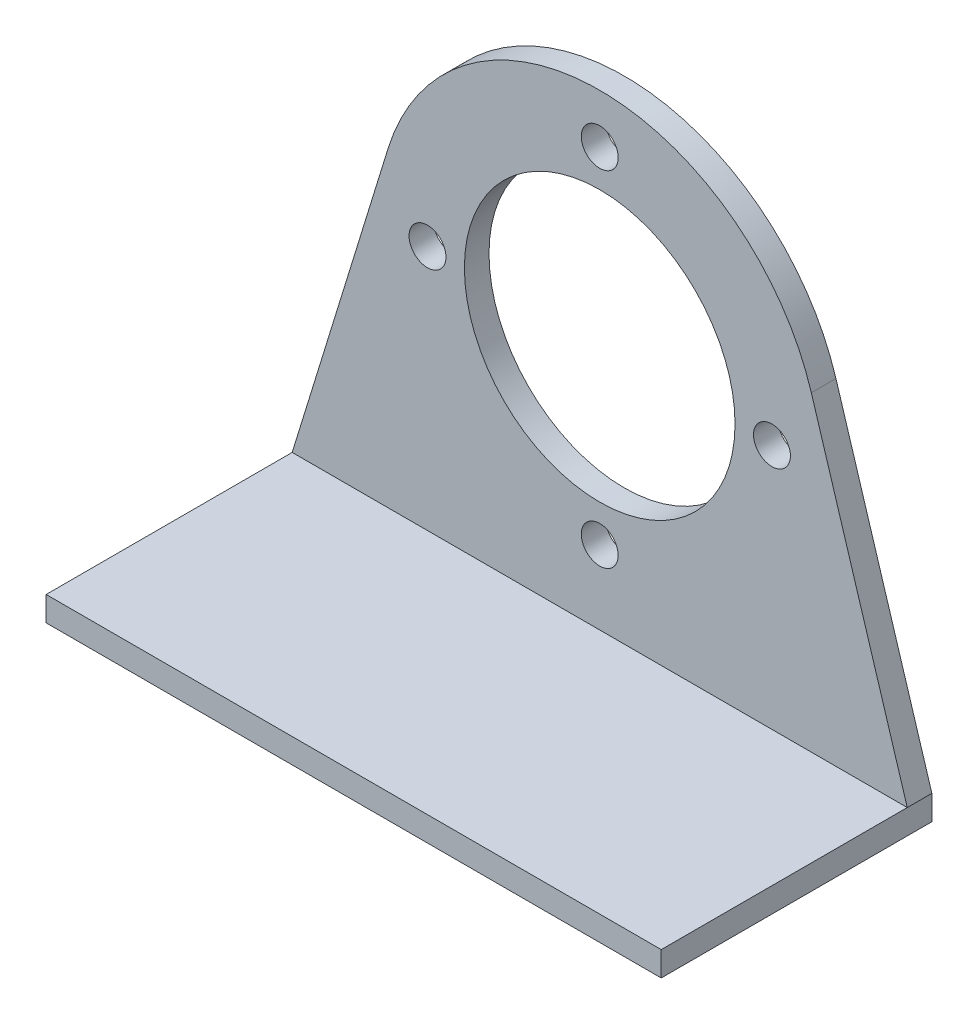
ISO-10303-21;
HEADER;
FILE_DESCRIPTION(('STEP AP214'),'2;1');
FILE_NAME('part.step','',(''),(''),'','','');
FILE_SCHEMA(('AUTOMOTIVE_DESIGN { 1 0 10303 214 1 1 1 1 }'));
ENDSEC;
DATA;
#1=APPLICATION_CONTEXT('core data for automotive mechanical design processes');
#2=APPLICATION_PROTOCOL_DEFINITION('international standard','automotive_design',2000,#1);
#3=PRODUCT_CONTEXT('',#1,'mechanical');
#4=PRODUCT('Part','Part','',(#3));
#5=PRODUCT_RELATED_PRODUCT_CATEGORY('part','',(#4));
#6=PRODUCT_DEFINITION_FORMATION('','',#4);
#7=PRODUCT_DEFINITION_CONTEXT('part definition',#1,'design');
#8=PRODUCT_DEFINITION('design','',#6,#7);
#9=PRODUCT_DEFINITION_SHAPE('','',#8);
#10=(LENGTH_UNIT() NAMED_UNIT(*) SI_UNIT(.MILLI.,.METRE.));
#11=(NAMED_UNIT(*) PLANE_ANGLE_UNIT() SI_UNIT($,.RADIAN.));
#12=(NAMED_UNIT(*) SI_UNIT($,.STERADIAN.) SOLID_ANGLE_UNIT());
#13=UNCERTAINTY_MEASURE_WITH_UNIT(LENGTH_MEASURE(1.E-05),#10,'distance_accuracy_value','');
#14=(GEOMETRIC_REPRESENTATION_CONTEXT(3) GLOBAL_UNCERTAINTY_ASSIGNED_CONTEXT((#13)) GLOBAL_UNIT_ASSIGNED_CONTEXT((#10,
#11,#12)) REPRESENTATION_CONTEXT('',''));
#15=CARTESIAN_POINT('',(0.,0.,0.));
#16=DIRECTION('',(0.,0.,1.));
#17=DIRECTION('',(1.,0.,0.));
#18=AXIS2_PLACEMENT_3D('',#15,#16,#17);
#19=CARTESIAN_POINT('',(0.,0.,2.));
#20=DIRECTION('',(0.,0.,-1.));
#21=DIRECTION('',(-1.,0.,0.));
#22=AXIS2_PLACEMENT_3D('',#19,#20,#21);
#23=PLANE('',#22);
#24=DIRECTION('',(-0.294546453408475,-0.955637162726779,0.));
#25=VECTOR('',#24,1.);
#26=CARTESIAN_POINT('',(-17.201468929082,5.30183616135254,2.));
#27=LINE('',#26,#25);
#28=CARTESIAN_POINT('',(-17.201468929082,5.30183616135254,2.));
#29=VERTEX_POINT('',#28);
#30=CARTESIAN_POINT('',(-25.,-20.,2.));
#31=VERTEX_POINT('',#30);
#32=EDGE_CURVE('E114',#29,#31,#27,.T.);
#33=ORIENTED_EDGE('',*,*,#32,.T.);
#34=DIRECTION('',(1.,0.,0.));
#35=VECTOR('',#34,1.);
#36=CARTESIAN_POINT('',(-25.,-20.,2.));
#37=LINE('',#36,#35);
#38=CARTESIAN_POINT('',(25.,-20.,2.));
#39=VERTEX_POINT('',#38);
#40=EDGE_CURVE('E83',#31,#39,#37,.T.);
#41=ORIENTED_EDGE('',*,*,#40,.T.);
#42=DIRECTION('',(-0.294546453408475,0.955637162726779,0.));
#43=VECTOR('',#42,1.);
#44=CARTESIAN_POINT('',(17.201468929082,5.30183616135254,2.));
#45=LINE('',#44,#43);
#46=CARTESIAN_POINT('',(17.201468929082,5.30183616135254,2.));
#47=VERTEX_POINT('',#46);
#48=EDGE_CURVE('E112',#39,#47,#45,.T.);
#49=ORIENTED_EDGE('',*,*,#48,.T.);
#50=CARTESIAN_POINT('',(0.,0.,2.));
#51=DIRECTION('',(0.,0.,1.));
#52=DIRECTION('',(-1.,0.,0.));
#53=AXIS2_PLACEMENT_3D('',#50,#51,#52);
#54=CIRCLE('',#53,18.);
#55=EDGE_CURVE('E61',#47,#29,#54,.T.);
#56=ORIENTED_EDGE('',*,*,#55,.T.);
#57=EDGE_LOOP('',(#33,#41,#49,#56));
#58=FACE_BOUND('',#57,.T.);
#59=CARTESIAN_POINT('',(0.,0.,2.));
#60=DIRECTION('',(0.,0.,1.));
#61=DIRECTION('',(1.,0.,0.));
#62=AXIS2_PLACEMENT_3D('',#59,#60,#61);
#63=CIRCLE('',#62,11.);
#64=CARTESIAN_POINT('',(11.,0.,2.));
#65=VERTEX_POINT('',#64);
#66=EDGE_CURVE('E130',#65,#65,#63,.T.);
#67=ORIENTED_EDGE('',*,*,#66,.F.);
#68=EDGE_LOOP('',(#67));
#69=FACE_BOUND('',#68,.T.);
#70=CARTESIAN_POINT('',(0.,14.,2.));
#71=DIRECTION('',(0.,0.,1.));
#72=DIRECTION('',(1.,0.,0.));
#73=AXIS2_PLACEMENT_3D('',#70,#71,#72);
#74=CIRCLE('',#73,1.5);
#75=CARTESIAN_POINT('',(1.5,14.,2.));
#76=VERTEX_POINT('',#75);
#77=EDGE_CURVE('E158',#76,#76,#74,.T.);
#78=ORIENTED_EDGE('',*,*,#77,.F.);
#79=EDGE_LOOP('',(#78));
#80=FACE_BOUND('',#79,.T.);
#81=CARTESIAN_POINT('',(14.,0.,2.));
#82=DIRECTION('',(0.,0.,1.));
#83=DIRECTION('',(1.,0.,0.));
#84=AXIS2_PLACEMENT_3D('',#81,#82,#83);
#85=CIRCLE('',#84,1.5);
#86=CARTESIAN_POINT('',(15.5,0.,2.));
#87=VERTEX_POINT('',#86);
#88=EDGE_CURVE('E166',#87,#87,#85,.T.);
#89=ORIENTED_EDGE('',*,*,#88,.F.);
#90=EDGE_LOOP('',(#89));
#91=FACE_BOUND('',#90,.T.);
#92=CARTESIAN_POINT('',(0.,-14.,2.));
#93=DIRECTION('',(0.,0.,1.));
#94=DIRECTION('',(1.,0.,0.));
#95=AXIS2_PLACEMENT_3D('',#92,#93,#94);
#96=CIRCLE('',#95,1.5);
#97=CARTESIAN_POINT('',(1.5,-14.,2.));
#98=VERTEX_POINT('',#97);
#99=EDGE_CURVE('E174',#98,#98,#96,.T.);
#100=ORIENTED_EDGE('',*,*,#99,.F.);
#101=EDGE_LOOP('',(#100));
#102=FACE_BOUND('',#101,.T.);
#103=CARTESIAN_POINT('',(-14.,0.,2.));
#104=DIRECTION('',(0.,0.,1.));
#105=DIRECTION('',(1.,0.,0.));
#106=AXIS2_PLACEMENT_3D('',#103,#104,#105);
#107=CIRCLE('',#106,1.5);
#108=CARTESIAN_POINT('',(-12.5,0.,2.));
#109=VERTEX_POINT('',#108);
#110=EDGE_CURVE('E182',#109,#109,#107,.T.);
#111=ORIENTED_EDGE('',*,*,#110,.F.);
#112=EDGE_LOOP('',(#111));
#113=FACE_BOUND('',#112,.T.);
#114=ADVANCED_FACE('F43',(#58,#69,#80,#91,#102,#113),#23,.F.);
#115=CARTESIAN_POINT('',(0.,0.,0.));
#116=DIRECTION('',(0.,0.,-1.));
#117=DIRECTION('',(-1.,0.,0.));
#118=AXIS2_PLACEMENT_3D('',#115,#116,#117);
#119=PLANE('',#118);
#120=CARTESIAN_POINT('',(0.,-14.,0.));
#121=DIRECTION('',(0.,0.,1.));
#122=DIRECTION('',(1.,0.,0.));
#123=AXIS2_PLACEMENT_3D('',#120,#121,#122);
#124=CIRCLE('',#123,1.5);
#125=CARTESIAN_POINT('',(1.5,-14.,0.));
#126=VERTEX_POINT('',#125);
#127=EDGE_CURVE('E178',#126,#126,#124,.T.);
#128=ORIENTED_EDGE('',*,*,#127,.T.);
#129=EDGE_LOOP('',(#128));
#130=FACE_BOUND('',#129,.T.);
#131=CARTESIAN_POINT('',(0.,14.,0.));
#132=DIRECTION('',(0.,0.,1.));
#133=DIRECTION('',(1.,0.,0.));
#134=AXIS2_PLACEMENT_3D('',#131,#132,#133);
#135=CIRCLE('',#134,1.5);
#136=CARTESIAN_POINT('',(1.5,14.,0.));
#137=VERTEX_POINT('',#136);
#138=EDGE_CURVE('E162',#137,#137,#135,.T.);
#139=ORIENTED_EDGE('',*,*,#138,.T.);
#140=EDGE_LOOP('',(#139));
#141=FACE_BOUND('',#140,.T.);
#142=DIRECTION('',(-0.294546453408475,-0.955637162726779,0.));
#143=VECTOR('',#142,1.);
#144=CARTESIAN_POINT('',(-17.201468929082,5.30183616135254,0.));
#145=LINE('',#144,#143);
#146=CARTESIAN_POINT('',(-17.201468929082,5.30183616135254,0.));
#147=VERTEX_POINT('',#146);
#148=CARTESIAN_POINT('',(-25.,-20.,0.));
#149=VERTEX_POINT('',#148);
#150=EDGE_CURVE('E126',#147,#149,#145,.T.);
#151=ORIENTED_EDGE('',*,*,#150,.F.);
#152=CARTESIAN_POINT('',(0.,0.,0.));
#153=DIRECTION('',(0.,0.,1.));
#154=DIRECTION('',(-1.,0.,0.));
#155=AXIS2_PLACEMENT_3D('',#152,#153,#154);
#156=CIRCLE('',#155,18.);
#157=CARTESIAN_POINT('',(17.201468929082,5.30183616135254,0.));
#158=VERTEX_POINT('',#157);
#159=EDGE_CURVE('E133',#158,#147,#156,.T.);
#160=ORIENTED_EDGE('',*,*,#159,.F.);
#161=DIRECTION('',(-0.294546453408475,0.955637162726779,0.));
#162=VECTOR('',#161,1.);
#163=CARTESIAN_POINT('',(17.201468929082,5.30183616135254,0.));
#164=LINE('',#163,#162);
#165=CARTESIAN_POINT('',(25.,-20.,0.));
#166=VERTEX_POINT('',#165);
#167=EDGE_CURVE('E73',#166,#158,#164,.T.);
#168=ORIENTED_EDGE('',*,*,#167,.F.);
#169=DIRECTION('',(0.,1.,0.));
#170=VECTOR('',#169,1.);
#171=CARTESIAN_POINT('',(25.,-20.,0.));
#172=LINE('',#171,#170);
#173=CARTESIAN_POINT('',(25.,-22.,0.));
#174=VERTEX_POINT('',#173);
#175=EDGE_CURVE('E99',#174,#166,#172,.T.);
#176=ORIENTED_EDGE('',*,*,#175,.F.);
#177=DIRECTION('',(1.,0.,0.));
#178=VECTOR('',#177,1.);
#179=CARTESIAN_POINT('',(-25.,-22.,0.));
#180=LINE('',#179,#178);
#181=CARTESIAN_POINT('',(-25.,-22.,0.));
#182=VERTEX_POINT('',#181);
#183=EDGE_CURVE('E204',#182,#174,#180,.T.);
#184=ORIENTED_EDGE('',*,*,#183,.F.);
#185=DIRECTION('',(0.,-1.,0.));
#186=VECTOR('',#185,1.);
#187=CARTESIAN_POINT('',(-25.,-20.,0.));
#188=LINE('',#187,#186);
#189=EDGE_CURVE('E150',#149,#182,#188,.T.);
#190=ORIENTED_EDGE('',*,*,#189,.F.);
#191=EDGE_LOOP('',(#151,#160,#168,#176,#184,#190));
#192=FACE_BOUND('',#191,.T.);
#193=CARTESIAN_POINT('',(0.,0.,0.));
#194=DIRECTION('',(0.,0.,1.));
#195=DIRECTION('',(1.,0.,0.));
#196=AXIS2_PLACEMENT_3D('',#193,#194,#195);
#197=CIRCLE('',#196,11.);
#198=CARTESIAN_POINT('',(11.,0.,0.));
#199=VERTEX_POINT('',#198);
#200=EDGE_CURVE('E154',#199,#199,#197,.T.);
#201=ORIENTED_EDGE('',*,*,#200,.T.);
#202=EDGE_LOOP('',(#201));
#203=FACE_BOUND('',#202,.T.);
#204=CARTESIAN_POINT('',(14.,0.,0.));
#205=DIRECTION('',(0.,0.,1.));
#206=DIRECTION('',(1.,0.,0.));
#207=AXIS2_PLACEMENT_3D('',#204,#205,#206);
#208=CIRCLE('',#207,1.5);
#209=CARTESIAN_POINT('',(15.5,0.,0.));
#210=VERTEX_POINT('',#209);
#211=EDGE_CURVE('E170',#210,#210,#208,.T.);
#212=ORIENTED_EDGE('',*,*,#211,.T.);
#213=EDGE_LOOP('',(#212));
#214=FACE_BOUND('',#213,.T.);
#215=CARTESIAN_POINT('',(-14.,0.,0.));
#216=DIRECTION('',(0.,0.,1.));
#217=DIRECTION('',(1.,0.,0.));
#218=AXIS2_PLACEMENT_3D('',#215,#216,#217);
#219=CIRCLE('',#218,1.5);
#220=CARTESIAN_POINT('',(-12.5,0.,0.));
#221=VERTEX_POINT('',#220);
#222=EDGE_CURVE('E186',#221,#221,#219,.T.);
#223=ORIENTED_EDGE('',*,*,#222,.T.);
#224=EDGE_LOOP('',(#223));
#225=FACE_BOUND('',#224,.T.);
#226=ADVANCED_FACE('F145',(#130,#141,#192,#203,#214,#225),#119,.T.);
#227=CARTESIAN_POINT('',(-17.201468929082,5.30183616135254,2.));
#228=DIRECTION('',(0.955637162726779,-0.294546453408475,0.));
#229=DIRECTION('',(0.294546453408475,0.95563716272678,0.));
#230=AXIS2_PLACEMENT_3D('',#227,#228,#229);
#231=PLANE('',#230);
#232=ORIENTED_EDGE('',*,*,#150,.T.);
#233=DIRECTION('',(0.,0.,-1.));
#234=VECTOR('',#233,1.);
#235=CARTESIAN_POINT('',(-25.,-20.,2.));
#236=LINE('',#235,#234);
#237=EDGE_CURVE('E11',#31,#149,#236,.T.);
#238=ORIENTED_EDGE('',*,*,#237,.F.);
#239=ORIENTED_EDGE('',*,*,#32,.F.);
#240=DIRECTION('',(0.,0.,-1.));
#241=VECTOR('',#240,1.);
#242=CARTESIAN_POINT('',(-17.201468929082,5.30183616135254,2.));
#243=LINE('',#242,#241);
#244=EDGE_CURVE('E122',#29,#147,#243,.T.);
#245=ORIENTED_EDGE('',*,*,#244,.T.);
#246=EDGE_LOOP('',(#232,#238,#239,#245));
#247=FACE_BOUND('',#246,.T.);
#248=ADVANCED_FACE('F45',(#247),#231,.F.);
#249=CARTESIAN_POINT('',(17.201468929082,5.30183616135254,2.));
#250=DIRECTION('',(-0.955637162726779,-0.294546453408475,0.));
#251=DIRECTION('',(0.294546453408475,-0.95563716272678,0.));
#252=AXIS2_PLACEMENT_3D('',#249,#250,#251);
#253=PLANE('',#252);
#254=ORIENTED_EDGE('',*,*,#167,.T.);
#255=DIRECTION('',(0.,0.,-1.));
#256=VECTOR('',#255,1.);
#257=CARTESIAN_POINT('',(17.201468929082,5.30183616135254,2.));
#258=LINE('',#257,#256);
#259=EDGE_CURVE('E102',#47,#158,#258,.T.);
#260=ORIENTED_EDGE('',*,*,#259,.F.);
#261=ORIENTED_EDGE('',*,*,#48,.F.);
#262=DIRECTION('',(0.,0.,-1.));
#263=VECTOR('',#262,1.);
#264=CARTESIAN_POINT('',(25.,-20.,2.));
#265=LINE('',#264,#263);
#266=EDGE_CURVE('E53',#39,#166,#265,.T.);
#267=ORIENTED_EDGE('',*,*,#266,.T.);
#268=EDGE_LOOP('',(#254,#260,#261,#267));
#269=FACE_BOUND('',#268,.T.);
#270=ADVANCED_FACE('F118',(#269),#253,.F.);
#271=CARTESIAN_POINT('',(0.,0.,2.));
#272=DIRECTION('',(0.,0.,-1.));
#273=DIRECTION('',(-1.,0.,0.));
#274=AXIS2_PLACEMENT_3D('',#271,#272,#273);
#275=CYLINDRICAL_SURFACE('',#274,18.);
#276=ORIENTED_EDGE('',*,*,#159,.T.);
#277=ORIENTED_EDGE('',*,*,#244,.F.);
#278=ORIENTED_EDGE('',*,*,#55,.F.);
#279=ORIENTED_EDGE('',*,*,#259,.T.);
#280=EDGE_LOOP('',(#276,#277,#278,#279));
#281=FACE_BOUND('',#280,.T.);
#282=ADVANCED_FACE('F142',(#281),#275,.T.);
#283=CARTESIAN_POINT('',(0.,0.,2.));
#284=DIRECTION('',(0.,0.,-1.));
#285=DIRECTION('',(-1.,0.,0.));
#286=AXIS2_PLACEMENT_3D('',#283,#284,#285);
#287=CYLINDRICAL_SURFACE('',#286,11.);
#288=ORIENTED_EDGE('',*,*,#66,.T.);
#289=EDGE_LOOP('',(#288));
#290=FACE_BOUND('',#289,.T.);
#291=ORIENTED_EDGE('',*,*,#200,.F.);
#292=EDGE_LOOP('',(#291));
#293=FACE_BOUND('',#292,.T.);
#294=ADVANCED_FACE('F259',(#290,#293),#287,.F.);
#295=CARTESIAN_POINT('',(0.,14.,2.));
#296=DIRECTION('',(0.,0.,-1.));
#297=DIRECTION('',(-1.,0.,0.));
#298=AXIS2_PLACEMENT_3D('',#295,#296,#297);
#299=CYLINDRICAL_SURFACE('',#298,1.5);
#300=ORIENTED_EDGE('',*,*,#77,.T.);
#301=EDGE_LOOP('',(#300));
#302=FACE_BOUND('',#301,.T.);
#303=ORIENTED_EDGE('',*,*,#138,.F.);
#304=EDGE_LOOP('',(#303));
#305=FACE_BOUND('',#304,.T.);
#306=ADVANCED_FACE('F313',(#302,#305),#299,.F.);
#307=CARTESIAN_POINT('',(14.,0.,2.));
#308=DIRECTION('',(0.,0.,-1.));
#309=DIRECTION('',(-1.,0.,0.));
#310=AXIS2_PLACEMENT_3D('',#307,#308,#309);
#311=CYLINDRICAL_SURFACE('',#310,1.5);
#312=ORIENTED_EDGE('',*,*,#88,.T.);
#313=EDGE_LOOP('',(#312));
#314=FACE_BOUND('',#313,.T.);
#315=ORIENTED_EDGE('',*,*,#211,.F.);
#316=EDGE_LOOP('',(#315));
#317=FACE_BOUND('',#316,.T.);
#318=ADVANCED_FACE('F302',(#314,#317),#311,.F.);
#319=CARTESIAN_POINT('',(0.,-14.,2.));
#320=DIRECTION('',(0.,0.,-1.));
#321=DIRECTION('',(-1.,0.,0.));
#322=AXIS2_PLACEMENT_3D('',#319,#320,#321);
#323=CYLINDRICAL_SURFACE('',#322,1.5);
#324=ORIENTED_EDGE('',*,*,#99,.T.);
#325=EDGE_LOOP('',(#324));
#326=FACE_BOUND('',#325,.T.);
#327=ORIENTED_EDGE('',*,*,#127,.F.);
#328=EDGE_LOOP('',(#327));
#329=FACE_BOUND('',#328,.T.);
#330=ADVANCED_FACE('F290',(#326,#329),#323,.F.);
#331=CARTESIAN_POINT('',(-14.,0.,2.));
#332=DIRECTION('',(0.,0.,-1.));
#333=DIRECTION('',(-1.,0.,0.));
#334=AXIS2_PLACEMENT_3D('',#331,#332,#333);
#335=CYLINDRICAL_SURFACE('',#334,1.5);
#336=ORIENTED_EDGE('',*,*,#110,.T.);
#337=EDGE_LOOP('',(#336));
#338=FACE_BOUND('',#337,.T.);
#339=ORIENTED_EDGE('',*,*,#222,.F.);
#340=EDGE_LOOP('',(#339));
#341=FACE_BOUND('',#340,.T.);
#342=ADVANCED_FACE('F286',(#338,#341),#335,.F.);
#343=CARTESIAN_POINT('',(-25.,-20.,0.));
#344=DIRECTION('',(0.,1.,0.));
#345=DIRECTION('',(0.,0.,1.));
#346=AXIS2_PLACEMENT_3D('',#343,#344,#345);
#347=PLANE('',#346);
#348=ORIENTED_EDGE('',*,*,#40,.F.);
#349=DIRECTION('',(0.,0.,1.));
#350=VECTOR('',#349,1.);
#351=CARTESIAN_POINT('',(-25.,-20.,0.));
#352=LINE('',#351,#350);
#353=CARTESIAN_POINT('',(-25.,-20.,22.));
#354=VERTEX_POINT('',#353);
#355=EDGE_CURVE('E108',#31,#354,#352,.T.);
#356=ORIENTED_EDGE('',*,*,#355,.T.);
#357=DIRECTION('',(-1.,0.,0.));
#358=VECTOR('',#357,1.);
#359=CARTESIAN_POINT('',(-25.,-20.,22.));
#360=LINE('',#359,#358);
#361=CARTESIAN_POINT('',(25.,-20.,22.));
#362=VERTEX_POINT('',#361);
#363=EDGE_CURVE('E106',#362,#354,#360,.T.);
#364=ORIENTED_EDGE('',*,*,#363,.F.);
#365=DIRECTION('',(0.,0.,1.));
#366=VECTOR('',#365,1.);
#367=CARTESIAN_POINT('',(25.,-20.,0.));
#368=LINE('',#367,#366);
#369=EDGE_CURVE('E95',#39,#362,#368,.T.);
#370=ORIENTED_EDGE('',*,*,#369,.F.);
#371=EDGE_LOOP('',(#348,#356,#364,#370));
#372=FACE_BOUND('',#371,.T.);
#373=ADVANCED_FACE('F104',(#372),#347,.T.);
#374=CARTESIAN_POINT('',(-25.,-20.,0.));
#375=DIRECTION('',(-1.,0.,0.));
#376=DIRECTION('',(0.,0.,1.));
#377=AXIS2_PLACEMENT_3D('',#374,#375,#376);
#378=PLANE('',#377);
#379=DIRECTION('',(0.,0.,1.));
#380=VECTOR('',#379,1.);
#381=CARTESIAN_POINT('',(-25.,-22.,0.));
#382=LINE('',#381,#380);
#383=CARTESIAN_POINT('',(-25.,-22.,22.));
#384=VERTEX_POINT('',#383);
#385=EDGE_CURVE('E193',#182,#384,#382,.T.);
#386=ORIENTED_EDGE('',*,*,#385,.T.);
#387=DIRECTION('',(0.,-1.,0.));
#388=VECTOR('',#387,1.);
#389=CARTESIAN_POINT('',(-25.,-20.,22.));
#390=LINE('',#389,#388);
#391=EDGE_CURVE('E219',#354,#384,#390,.T.);
#392=ORIENTED_EDGE('',*,*,#391,.F.);
#393=ORIENTED_EDGE('',*,*,#355,.F.);
#394=ORIENTED_EDGE('',*,*,#237,.T.);
#395=ORIENTED_EDGE('',*,*,#189,.T.);
#396=EDGE_LOOP('',(#386,#392,#393,#394,#395));
#397=FACE_BOUND('',#396,.T.);
#398=ADVANCED_FACE('F231',(#397),#378,.T.);
#399=CARTESIAN_POINT('',(25.,-20.,0.));
#400=DIRECTION('',(1.,0.,0.));
#401=DIRECTION('',(0.,0.,-1.));
#402=AXIS2_PLACEMENT_3D('',#399,#400,#401);
#403=PLANE('',#402);
#404=ORIENTED_EDGE('',*,*,#266,.F.);
#405=ORIENTED_EDGE('',*,*,#369,.T.);
#406=DIRECTION('',(0.,1.,0.));
#407=VECTOR('',#406,1.);
#408=CARTESIAN_POINT('',(25.,-20.,22.));
#409=LINE('',#408,#407);
#410=CARTESIAN_POINT('',(25.,-22.,22.));
#411=VERTEX_POINT('',#410);
#412=EDGE_CURVE('E212',#411,#362,#409,.T.);
#413=ORIENTED_EDGE('',*,*,#412,.F.);
#414=DIRECTION('',(0.,0.,1.));
#415=VECTOR('',#414,1.);
#416=CARTESIAN_POINT('',(25.,-22.,0.));
#417=LINE('',#416,#415);
#418=EDGE_CURVE('E109',#174,#411,#417,.T.);
#419=ORIENTED_EDGE('',*,*,#418,.F.);
#420=ORIENTED_EDGE('',*,*,#175,.T.);
#421=EDGE_LOOP('',(#404,#405,#413,#419,#420));
#422=FACE_BOUND('',#421,.T.);
#423=ADVANCED_FACE('F92',(#422),#403,.T.);
#424=CARTESIAN_POINT('',(-25.,-22.,0.));
#425=DIRECTION('',(0.,-1.,0.));
#426=DIRECTION('',(0.,0.,-1.));
#427=AXIS2_PLACEMENT_3D('',#424,#425,#426);
#428=PLANE('',#427);
#429=ORIENTED_EDGE('',*,*,#418,.T.);
#430=DIRECTION('',(1.,0.,0.));
#431=VECTOR('',#430,1.);
#432=CARTESIAN_POINT('',(-25.,-22.,22.));
#433=LINE('',#432,#431);
#434=EDGE_CURVE('E215',#384,#411,#433,.T.);
#435=ORIENTED_EDGE('',*,*,#434,.F.);
#436=ORIENTED_EDGE('',*,*,#385,.F.);
#437=ORIENTED_EDGE('',*,*,#183,.T.);
#438=EDGE_LOOP('',(#429,#435,#436,#437));
#439=FACE_BOUND('',#438,.T.);
#440=ADVANCED_FACE('F241',(#439),#428,.T.);
#441=CARTESIAN_POINT('',(0.,0.,22.));
#442=DIRECTION('',(0.,0.,1.));
#443=DIRECTION('',(1.,0.,0.));
#444=AXIS2_PLACEMENT_3D('',#441,#442,#443);
#445=PLANE('',#444);
#446=ORIENTED_EDGE('',*,*,#391,.T.);
#447=ORIENTED_EDGE('',*,*,#434,.T.);
#448=ORIENTED_EDGE('',*,*,#412,.T.);
#449=ORIENTED_EDGE('',*,*,#363,.T.);
#450=EDGE_LOOP('',(#446,#447,#448,#449));
#451=FACE_BOUND('',#450,.T.);
#452=ADVANCED_FACE('F225',(#451),#445,.T.);
#453=CLOSED_SHELL('',(#114,#226,#248,#270,#282,#294,#306,#318,#330,#342,#373,#398,#423,#440,#452));
#454=MANIFOLD_SOLID_BREP('B2',#453);
#455=ADVANCED_BREP_SHAPE_REPRESENTATION('',(#18,#454),#14);
#456=SHAPE_DEFINITION_REPRESENTATION(#9,#455);
ENDSEC;
END-ISO-10303-21;
